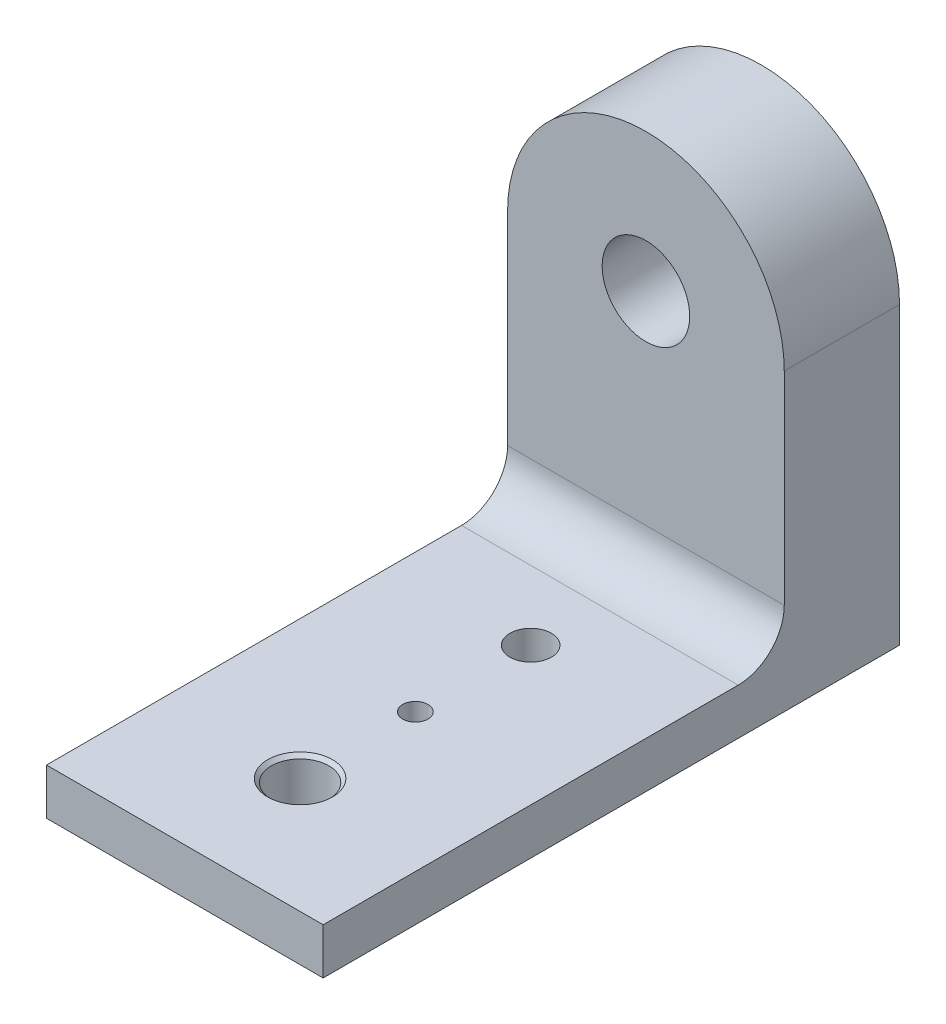
ISO-10303-21;
HEADER;
FILE_DESCRIPTION(('STEP AP214'),'2;1');
FILE_NAME('part.step','',(''),(''),'','','');
FILE_SCHEMA(('AUTOMOTIVE_DESIGN { 1 0 10303 214 1 1 1 1 }'));
ENDSEC;
DATA;
#1=APPLICATION_CONTEXT('core data for automotive mechanical design processes');
#2=APPLICATION_PROTOCOL_DEFINITION('international standard','automotive_design',2000,#1);
#3=PRODUCT_CONTEXT('',#1,'mechanical');
#4=PRODUCT('Part','Part','',(#3));
#5=PRODUCT_RELATED_PRODUCT_CATEGORY('part','',(#4));
#6=PRODUCT_DEFINITION_FORMATION('','',#4);
#7=PRODUCT_DEFINITION_CONTEXT('part definition',#1,'design');
#8=PRODUCT_DEFINITION('design','',#6,#7);
#9=PRODUCT_DEFINITION_SHAPE('','',#8);
#10=(LENGTH_UNIT() NAMED_UNIT(*) SI_UNIT(.MILLI.,.METRE.));
#11=(NAMED_UNIT(*) PLANE_ANGLE_UNIT() SI_UNIT($,.RADIAN.));
#12=(NAMED_UNIT(*) SI_UNIT($,.STERADIAN.) SOLID_ANGLE_UNIT());
#13=UNCERTAINTY_MEASURE_WITH_UNIT(LENGTH_MEASURE(1.E-05),#10,'distance_accuracy_value','');
#14=(GEOMETRIC_REPRESENTATION_CONTEXT(3) GLOBAL_UNCERTAINTY_ASSIGNED_CONTEXT((#13)) GLOBAL_UNIT_ASSIGNED_CONTEXT((#10,
#11,#12)) REPRESENTATION_CONTEXT('',''));
#15=CARTESIAN_POINT('',(0.,0.,0.));
#16=DIRECTION('',(0.,0.,1.));
#17=DIRECTION('',(1.,0.,0.));
#18=AXIS2_PLACEMENT_3D('',#15,#16,#17);
#19=CARTESIAN_POINT('',(0.,10.,0.));
#20=DIRECTION('',(1.,0.,0.));
#21=DIRECTION('',(0.,0.,-1.));
#22=AXIS2_PLACEMENT_3D('',#19,#20,#21);
#23=PLANE('',#22);
#24=DIRECTION('',(0.,0.,1.));
#25=VECTOR('',#24,1.);
#26=CARTESIAN_POINT('',(0.,0.,0.));
#27=LINE('',#26,#25);
#28=CARTESIAN_POINT('',(0.,0.,-125.));
#29=VERTEX_POINT('',#28);
#30=CARTESIAN_POINT('',(0.,0.,0.));
#31=VERTEX_POINT('',#30);
#32=EDGE_CURVE('E129',#29,#31,#27,.T.);
#33=ORIENTED_EDGE('',*,*,#32,.T.);
#34=DIRECTION('',(0.,-1.,0.));
#35=VECTOR('',#34,1.);
#36=CARTESIAN_POINT('',(0.,10.,0.));
#37=LINE('',#36,#35);
#38=CARTESIAN_POINT('',(0.,10.,0.));
#39=VERTEX_POINT('',#38);
#40=EDGE_CURVE('E146',#39,#31,#37,.T.);
#41=ORIENTED_EDGE('',*,*,#40,.F.);
#42=DIRECTION('',(0.,0.,1.));
#43=VECTOR('',#42,1.);
#44=CARTESIAN_POINT('',(0.,10.,0.));
#45=LINE('',#44,#43);
#46=CARTESIAN_POINT('',(0.,10.,-90.));
#47=VERTEX_POINT('',#46);
#48=EDGE_CURVE('E136',#47,#39,#45,.T.);
#49=ORIENTED_EDGE('',*,*,#48,.F.);
#50=CARTESIAN_POINT('',(0.,20.,-90.));
#51=DIRECTION('',(1.,0.,0.));
#52=DIRECTION('',(0.,0.,-1.));
#53=AXIS2_PLACEMENT_3D('',#50,#51,#52);
#54=CIRCLE('',#53,10.);
#55=CARTESIAN_POINT('',(0.,20.,-100.));
#56=VERTEX_POINT('',#55);
#57=EDGE_CURVE('E50',#47,#56,#54,.T.);
#58=ORIENTED_EDGE('',*,*,#57,.T.);
#59=DIRECTION('',(0.,1.,0.));
#60=VECTOR('',#59,1.);
#61=CARTESIAN_POINT('',(0.,10.,-100.));
#62=LINE('',#61,#60);
#63=CARTESIAN_POINT('',(0.,64.,-100.));
#64=VERTEX_POINT('',#63);
#65=EDGE_CURVE('E98',#56,#64,#62,.T.);
#66=ORIENTED_EDGE('',*,*,#65,.T.);
#67=DIRECTION('',(0.,0.,-1.));
#68=VECTOR('',#67,1.);
#69=CARTESIAN_POINT('',(0.,64.,-100.));
#70=LINE('',#69,#68);
#71=CARTESIAN_POINT('',(0.,64.,-125.));
#72=VERTEX_POINT('',#71);
#73=EDGE_CURVE('E102',#64,#72,#70,.T.);
#74=ORIENTED_EDGE('',*,*,#73,.T.);
#75=DIRECTION('',(0.,-1.,0.));
#76=VECTOR('',#75,1.);
#77=CARTESIAN_POINT('',(0.,10.,-125.));
#78=LINE('',#77,#76);
#79=EDGE_CURVE('E178',#72,#29,#78,.T.);
#80=ORIENTED_EDGE('',*,*,#79,.T.);
#81=EDGE_LOOP('',(#33,#41,#49,#58,#66,#74,#80));
#82=FACE_BOUND('',#81,.T.);
#83=ADVANCED_FACE('F41',(#82),#23,.F.);
#84=CARTESIAN_POINT('',(0.,10.,0.));
#85=DIRECTION('',(0.,0.,-1.));
#86=DIRECTION('',(-1.,0.,0.));
#87=AXIS2_PLACEMENT_3D('',#84,#85,#86);
#88=PLANE('',#87);
#89=DIRECTION('',(1.,0.,0.));
#90=VECTOR('',#89,1.);
#91=CARTESIAN_POINT('',(0.,0.,0.));
#92=LINE('',#91,#90);
#93=CARTESIAN_POINT('',(60.,0.,0.));
#94=VERTEX_POINT('',#93);
#95=EDGE_CURVE('E186',#31,#94,#92,.T.);
#96=ORIENTED_EDGE('',*,*,#95,.T.);
#97=DIRECTION('',(0.,-1.,0.));
#98=VECTOR('',#97,1.);
#99=CARTESIAN_POINT('',(60.,10.,0.));
#100=LINE('',#99,#98);
#101=CARTESIAN_POINT('',(60.,10.,0.));
#102=VERTEX_POINT('',#101);
#103=EDGE_CURVE('E169',#102,#94,#100,.T.);
#104=ORIENTED_EDGE('',*,*,#103,.F.);
#105=DIRECTION('',(1.,0.,0.));
#106=VECTOR('',#105,1.);
#107=CARTESIAN_POINT('',(0.,10.,0.));
#108=LINE('',#107,#106);
#109=EDGE_CURVE('E133',#39,#102,#108,.T.);
#110=ORIENTED_EDGE('',*,*,#109,.F.);
#111=ORIENTED_EDGE('',*,*,#40,.T.);
#112=EDGE_LOOP('',(#96,#104,#110,#111));
#113=FACE_BOUND('',#112,.T.);
#114=ADVANCED_FACE('F194',(#113),#88,.F.);
#115=CARTESIAN_POINT('',(60.,10.,0.));
#116=DIRECTION('',(-1.,0.,0.));
#117=DIRECTION('',(0.,0.,1.));
#118=AXIS2_PLACEMENT_3D('',#115,#116,#117);
#119=PLANE('',#118);
#120=DIRECTION('',(0.,0.,-1.));
#121=VECTOR('',#120,1.);
#122=CARTESIAN_POINT('',(60.,0.,0.));
#123=LINE('',#122,#121);
#124=CARTESIAN_POINT('',(60.,0.,-125.));
#125=VERTEX_POINT('',#124);
#126=EDGE_CURVE('E183',#94,#125,#123,.T.);
#127=ORIENTED_EDGE('',*,*,#126,.T.);
#128=DIRECTION('',(0.,-1.,0.));
#129=VECTOR('',#128,1.);
#130=CARTESIAN_POINT('',(60.,10.,-125.));
#131=LINE('',#130,#129);
#132=CARTESIAN_POINT('',(60.,64.,-125.));
#133=VERTEX_POINT('',#132);
#134=EDGE_CURVE('E172',#133,#125,#131,.T.);
#135=ORIENTED_EDGE('',*,*,#134,.F.);
#136=DIRECTION('',(0.,0.,-1.));
#137=VECTOR('',#136,1.);
#138=CARTESIAN_POINT('',(60.,64.,-100.));
#139=LINE('',#138,#137);
#140=CARTESIAN_POINT('',(60.,64.,-100.));
#141=VERTEX_POINT('',#140);
#142=EDGE_CURVE('E116',#141,#133,#139,.T.);
#143=ORIENTED_EDGE('',*,*,#142,.F.);
#144=DIRECTION('',(0.,-1.,0.));
#145=VECTOR('',#144,1.);
#146=CARTESIAN_POINT('',(60.,10.,-100.));
#147=LINE('',#146,#145);
#148=CARTESIAN_POINT('',(60.,20.,-100.));
#149=VERTEX_POINT('',#148);
#150=EDGE_CURVE('E107',#141,#149,#147,.T.);
#151=ORIENTED_EDGE('',*,*,#150,.T.);
#152=CARTESIAN_POINT('',(60.,20.,-90.));
#153=DIRECTION('',(-1.,0.,0.));
#154=DIRECTION('',(0.,0.,1.));
#155=AXIS2_PLACEMENT_3D('',#152,#153,#154);
#156=CIRCLE('',#155,10.);
#157=CARTESIAN_POINT('',(60.,10.,-90.));
#158=VERTEX_POINT('',#157);
#159=EDGE_CURVE('E11',#149,#158,#156,.T.);
#160=ORIENTED_EDGE('',*,*,#159,.T.);
#161=DIRECTION('',(0.,0.,-1.));
#162=VECTOR('',#161,1.);
#163=CARTESIAN_POINT('',(60.,10.,0.));
#164=LINE('',#163,#162);
#165=EDGE_CURVE('E151',#102,#158,#164,.T.);
#166=ORIENTED_EDGE('',*,*,#165,.F.);
#167=ORIENTED_EDGE('',*,*,#103,.T.);
#168=EDGE_LOOP('',(#127,#135,#143,#151,#160,#166,#167));
#169=FACE_BOUND('',#168,.T.);
#170=ADVANCED_FACE('F156',(#169),#119,.F.);
#171=CARTESIAN_POINT('',(0.,10.,-125.));
#172=DIRECTION('',(0.,0.,1.));
#173=DIRECTION('',(1.,0.,0.));
#174=AXIS2_PLACEMENT_3D('',#171,#172,#173);
#175=PLANE('',#174);
#176=DIRECTION('',(-1.,0.,0.));
#177=VECTOR('',#176,1.);
#178=CARTESIAN_POINT('',(0.,0.,-125.));
#179=LINE('',#178,#177);
#180=EDGE_CURVE('E140',#125,#29,#179,.T.);
#181=ORIENTED_EDGE('',*,*,#180,.T.);
#182=ORIENTED_EDGE('',*,*,#79,.F.);
#183=CARTESIAN_POINT('',(30.,64.,-125.));
#184=DIRECTION('',(0.,0.,-1.));
#185=DIRECTION('',(-1.,0.,0.));
#186=AXIS2_PLACEMENT_3D('',#183,#184,#185);
#187=CIRCLE('',#186,30.);
#188=EDGE_CURVE('E114',#72,#133,#187,.T.);
#189=ORIENTED_EDGE('',*,*,#188,.T.);
#190=ORIENTED_EDGE('',*,*,#134,.T.);
#191=EDGE_LOOP('',(#181,#182,#189,#190));
#192=FACE_BOUND('',#191,.T.);
#193=CARTESIAN_POINT('',(30.,64.,-125.));
#194=DIRECTION('',(0.,0.,-1.));
#195=DIRECTION('',(-1.,0.,0.));
#196=AXIS2_PLACEMENT_3D('',#193,#194,#195);
#197=CIRCLE('',#196,9.5);
#198=CARTESIAN_POINT('',(20.5,64.,-125.));
#199=VERTEX_POINT('',#198);
#200=EDGE_CURVE('E123',#199,#199,#197,.T.);
#201=ORIENTED_EDGE('',*,*,#200,.F.);
#202=EDGE_LOOP('',(#201));
#203=FACE_BOUND('',#202,.T.);
#204=ADVANCED_FACE('F200',(#192,#203),#175,.F.);
#205=CARTESIAN_POINT('',(0.,10.,-125.));
#206=DIRECTION('',(0.,-1.,0.));
#207=DIRECTION('',(0.,0.,-1.));
#208=AXIS2_PLACEMENT_3D('',#205,#206,#207);
#209=PLANE('',#208);
#210=CARTESIAN_POINT('',(30.,10.,-25.));
#211=DIRECTION('',(0.,1.,0.));
#212=DIRECTION('',(0.,0.,1.));
#213=AXIS2_PLACEMENT_3D('',#210,#211,#212);
#214=CIRCLE('',#213,7.025);
#215=CARTESIAN_POINT('',(30.,10.,-17.975));
#216=VERTEX_POINT('',#215);
#217=EDGE_CURVE('E237',#216,#216,#214,.T.);
#218=ORIENTED_EDGE('',*,*,#217,.F.);
#219=EDGE_LOOP('',(#218));
#220=FACE_BOUND('',#219,.T.);
#221=CARTESIAN_POINT('',(30.,10.,-75.));
#222=DIRECTION('',(0.,1.,0.));
#223=DIRECTION('',(0.,0.,1.));
#224=AXIS2_PLACEMENT_3D('',#221,#222,#223);
#225=CIRCLE('',#224,4.49999999999999);
#226=CARTESIAN_POINT('',(30.,10.,-70.5));
#227=VERTEX_POINT('',#226);
#228=EDGE_CURVE('E225',#227,#227,#225,.T.);
#229=ORIENTED_EDGE('',*,*,#228,.F.);
#230=EDGE_LOOP('',(#229));
#231=FACE_BOUND('',#230,.T.);
#232=CARTESIAN_POINT('',(30.,10.,-50.));
#233=DIRECTION('',(0.,1.,0.));
#234=DIRECTION('',(0.,0.,1.));
#235=AXIS2_PLACEMENT_3D('',#232,#233,#234);
#236=CIRCLE('',#235,2.75);
#237=CARTESIAN_POINT('',(30.,10.,-47.25));
#238=VERTEX_POINT('',#237);
#239=EDGE_CURVE('E208',#238,#238,#236,.T.);
#240=ORIENTED_EDGE('',*,*,#239,.F.);
#241=EDGE_LOOP('',(#240));
#242=FACE_BOUND('',#241,.T.);
#243=ORIENTED_EDGE('',*,*,#165,.T.);
#244=DIRECTION('',(-1.,0.,0.));
#245=VECTOR('',#244,1.);
#246=CARTESIAN_POINT('',(0.,10.,-90.));
#247=LINE('',#246,#245);
#248=EDGE_CURVE('E143',#158,#47,#247,.T.);
#249=ORIENTED_EDGE('',*,*,#248,.T.);
#250=ORIENTED_EDGE('',*,*,#48,.T.);
#251=ORIENTED_EDGE('',*,*,#109,.T.);
#252=EDGE_LOOP('',(#243,#249,#250,#251));
#253=FACE_BOUND('',#252,.T.);
#254=ADVANCED_FACE('F162',(#220,#231,#242,#253),#209,.F.);
#255=CARTESIAN_POINT('',(0.,0.,-125.));
#256=DIRECTION('',(0.,-1.,0.));
#257=DIRECTION('',(0.,0.,-1.));
#258=AXIS2_PLACEMENT_3D('',#255,#256,#257);
#259=PLANE('',#258);
#260=CARTESIAN_POINT('',(30.,0.,-25.));
#261=DIRECTION('',(0.,1.,0.));
#262=DIRECTION('',(0.,0.,1.));
#263=AXIS2_PLACEMENT_3D('',#260,#261,#262);
#264=CIRCLE('',#263,6.25);
#265=CARTESIAN_POINT('',(30.,0.,-18.75));
#266=VERTEX_POINT('',#265);
#267=EDGE_CURVE('E229',#266,#266,#264,.T.);
#268=ORIENTED_EDGE('',*,*,#267,.T.);
#269=EDGE_LOOP('',(#268));
#270=FACE_BOUND('',#269,.T.);
#271=CARTESIAN_POINT('',(30.,0.,-75.));
#272=DIRECTION('',(0.,1.,0.));
#273=DIRECTION('',(0.,0.,1.));
#274=AXIS2_PLACEMENT_3D('',#271,#272,#273);
#275=CIRCLE('',#274,4.49999999999999);
#276=CARTESIAN_POINT('',(30.,0.,-70.5));
#277=VERTEX_POINT('',#276);
#278=EDGE_CURVE('E219',#277,#277,#275,.T.);
#279=ORIENTED_EDGE('',*,*,#278,.T.);
#280=EDGE_LOOP('',(#279));
#281=FACE_BOUND('',#280,.T.);
#282=CARTESIAN_POINT('',(30.,0.,-50.));
#283=DIRECTION('',(0.,-1.,0.));
#284=DIRECTION('',(0.,0.,-1.));
#285=AXIS2_PLACEMENT_3D('',#282,#283,#284);
#286=CIRCLE('',#285,2.75);
#287=CARTESIAN_POINT('',(30.,0.,-52.75));
#288=VERTEX_POINT('',#287);
#289=EDGE_CURVE('E213',#288,#288,#286,.F.);
#290=ORIENTED_EDGE('',*,*,#289,.T.);
#291=EDGE_LOOP('',(#290));
#292=FACE_BOUND('',#291,.T.);
#293=ORIENTED_EDGE('',*,*,#32,.F.);
#294=ORIENTED_EDGE('',*,*,#180,.F.);
#295=ORIENTED_EDGE('',*,*,#126,.F.);
#296=ORIENTED_EDGE('',*,*,#95,.F.);
#297=EDGE_LOOP('',(#293,#294,#295,#296));
#298=FACE_BOUND('',#297,.T.);
#299=ADVANCED_FACE('F198',(#270,#281,#292,#298),#259,.T.);
#300=CARTESIAN_POINT('',(30.,64.,-100.));
#301=DIRECTION('',(0.,0.,-1.));
#302=DIRECTION('',(-1.,0.,0.));
#303=AXIS2_PLACEMENT_3D('',#300,#301,#302);
#304=CYLINDRICAL_SURFACE('',#303,30.);
#305=ORIENTED_EDGE('',*,*,#188,.F.);
#306=ORIENTED_EDGE('',*,*,#73,.F.);
#307=CARTESIAN_POINT('',(30.,64.,-100.));
#308=DIRECTION('',(0.,0.,-1.));
#309=DIRECTION('',(-1.,0.,0.));
#310=AXIS2_PLACEMENT_3D('',#307,#308,#309);
#311=CIRCLE('',#310,30.);
#312=EDGE_CURVE('E106',#64,#141,#311,.T.);
#313=ORIENTED_EDGE('',*,*,#312,.T.);
#314=ORIENTED_EDGE('',*,*,#142,.T.);
#315=EDGE_LOOP('',(#305,#306,#313,#314));
#316=FACE_BOUND('',#315,.T.);
#317=ADVANCED_FACE('F111',(#316),#304,.T.);
#318=CARTESIAN_POINT('',(30.,64.,-100.));
#319=DIRECTION('',(0.,0.,-1.));
#320=DIRECTION('',(-1.,0.,0.));
#321=AXIS2_PLACEMENT_3D('',#318,#319,#320);
#322=PLANE('',#321);
#323=CARTESIAN_POINT('',(30.,64.,-100.));
#324=DIRECTION('',(0.,0.,-1.));
#325=DIRECTION('',(-1.,0.,0.));
#326=AXIS2_PLACEMENT_3D('',#323,#324,#325);
#327=CIRCLE('',#326,9.5);
#328=CARTESIAN_POINT('',(20.5,64.,-100.));
#329=VERTEX_POINT('',#328);
#330=EDGE_CURVE('E127',#329,#329,#327,.T.);
#331=ORIENTED_EDGE('',*,*,#330,.T.);
#332=EDGE_LOOP('',(#331));
#333=FACE_BOUND('',#332,.T.);
#334=ORIENTED_EDGE('',*,*,#65,.F.);
#335=DIRECTION('',(-1.,0.,0.));
#336=VECTOR('',#335,1.);
#337=CARTESIAN_POINT('',(60.,20.,-100.));
#338=LINE('',#337,#336);
#339=EDGE_CURVE('E63',#56,#149,#338,.F.);
#340=ORIENTED_EDGE('',*,*,#339,.T.);
#341=ORIENTED_EDGE('',*,*,#150,.F.);
#342=ORIENTED_EDGE('',*,*,#312,.F.);
#343=EDGE_LOOP('',(#334,#340,#341,#342));
#344=FACE_BOUND('',#343,.T.);
#345=ADVANCED_FACE('F118',(#333,#344),#322,.F.);
#346=CARTESIAN_POINT('',(30.,64.,-100.));
#347=DIRECTION('',(0.,0.,-1.));
#348=DIRECTION('',(-1.,0.,0.));
#349=AXIS2_PLACEMENT_3D('',#346,#347,#348);
#350=CYLINDRICAL_SURFACE('',#349,9.5);
#351=ORIENTED_EDGE('',*,*,#330,.F.);
#352=EDGE_LOOP('',(#351));
#353=FACE_BOUND('',#352,.T.);
#354=ORIENTED_EDGE('',*,*,#200,.T.);
#355=EDGE_LOOP('',(#354));
#356=FACE_BOUND('',#355,.T.);
#357=ADVANCED_FACE('F262',(#353,#356),#350,.F.);
#358=CARTESIAN_POINT('',(30.,-0.000999999999999265,-50.));
#359=DIRECTION('',(0.,1.,0.));
#360=DIRECTION('',(0.,0.,1.));
#361=AXIS2_PLACEMENT_3D('',#358,#359,#360);
#362=CYLINDRICAL_SURFACE('',#361,2.75);
#363=ORIENTED_EDGE('',*,*,#289,.F.);
#364=EDGE_LOOP('',(#363));
#365=FACE_BOUND('',#364,.T.);
#366=ORIENTED_EDGE('',*,*,#239,.T.);
#367=EDGE_LOOP('',(#366));
#368=FACE_BOUND('',#367,.T.);
#369=ADVANCED_FACE('F253',(#365,#368),#362,.F.);
#370=CARTESIAN_POINT('',(30.,10.,-75.));
#371=DIRECTION('',(0.,1.,0.));
#372=DIRECTION('',(0.,0.,1.));
#373=AXIS2_PLACEMENT_3D('',#370,#371,#372);
#374=CYLINDRICAL_SURFACE('',#373,4.49999999999999);
#375=ORIENTED_EDGE('',*,*,#278,.F.);
#376=EDGE_LOOP('',(#375));
#377=FACE_BOUND('',#376,.T.);
#378=ORIENTED_EDGE('',*,*,#228,.T.);
#379=EDGE_LOOP('',(#378));
#380=FACE_BOUND('',#379,.T.);
#381=ADVANCED_FACE('F250',(#377,#380),#374,.F.);
#382=CARTESIAN_POINT('',(30.,10.,-25.));
#383=DIRECTION('',(0.,1.,0.));
#384=DIRECTION('',(0.,0.,1.));
#385=AXIS2_PLACEMENT_3D('',#382,#383,#384);
#386=CYLINDRICAL_SURFACE('',#385,6.25);
#387=ORIENTED_EDGE('',*,*,#267,.F.);
#388=EDGE_LOOP('',(#387));
#389=FACE_BOUND('',#388,.T.);
#390=CARTESIAN_POINT('',(30.,9.225,-25.));
#391=DIRECTION('',(0.,1.,0.));
#392=DIRECTION('',(0.,0.,1.));
#393=AXIS2_PLACEMENT_3D('',#390,#391,#392);
#394=CIRCLE('',#393,6.25);
#395=CARTESIAN_POINT('',(30.,9.225,-18.75));
#396=VERTEX_POINT('',#395);
#397=EDGE_CURVE('E233',#396,#396,#394,.T.);
#398=ORIENTED_EDGE('',*,*,#397,.T.);
#399=EDGE_LOOP('',(#398));
#400=FACE_BOUND('',#399,.T.);
#401=ADVANCED_FACE('F252',(#389,#400),#386,.F.);
#402=CARTESIAN_POINT('',(30.,10.,-25.));
#403=DIRECTION('',(0.,1.,0.));
#404=DIRECTION('',(0.,0.,1.));
#405=AXIS2_PLACEMENT_3D('',#402,#403,#404);
#406=CONICAL_SURFACE('',#405,7.025,0.785398163397449);
#407=ORIENTED_EDGE('',*,*,#397,.F.);
#408=EDGE_LOOP('',(#407));
#409=FACE_BOUND('',#408,.T.);
#410=ORIENTED_EDGE('',*,*,#217,.T.);
#411=EDGE_LOOP('',(#410));
#412=FACE_BOUND('',#411,.T.);
#413=ADVANCED_FACE('F242',(#409,#412),#406,.F.);
#414=CARTESIAN_POINT('',(0.,20.,-90.));
#415=DIRECTION('',(1.,0.,0.));
#416=DIRECTION('',(0.,0.,-1.));
#417=AXIS2_PLACEMENT_3D('',#414,#415,#416);
#418=CYLINDRICAL_SURFACE('',#417,10.);
#419=ORIENTED_EDGE('',*,*,#159,.F.);
#420=ORIENTED_EDGE('',*,*,#339,.F.);
#421=ORIENTED_EDGE('',*,*,#57,.F.);
#422=ORIENTED_EDGE('',*,*,#248,.F.);
#423=EDGE_LOOP('',(#419,#420,#421,#422));
#424=FACE_BOUND('',#423,.T.);
#425=ADVANCED_FACE('F43',(#424),#418,.F.);
#426=CLOSED_SHELL('',(#83,#114,#170,#204,#254,#299,#317,#345,#357,#369,#381,#401,#413,#425));
#427=MANIFOLD_SOLID_BREP('B2',#426);
#428=ADVANCED_BREP_SHAPE_REPRESENTATION('',(#18,#427),#14);
#429=SHAPE_DEFINITION_REPRESENTATION(#9,#428);
ENDSEC;
END-ISO-10303-21;
